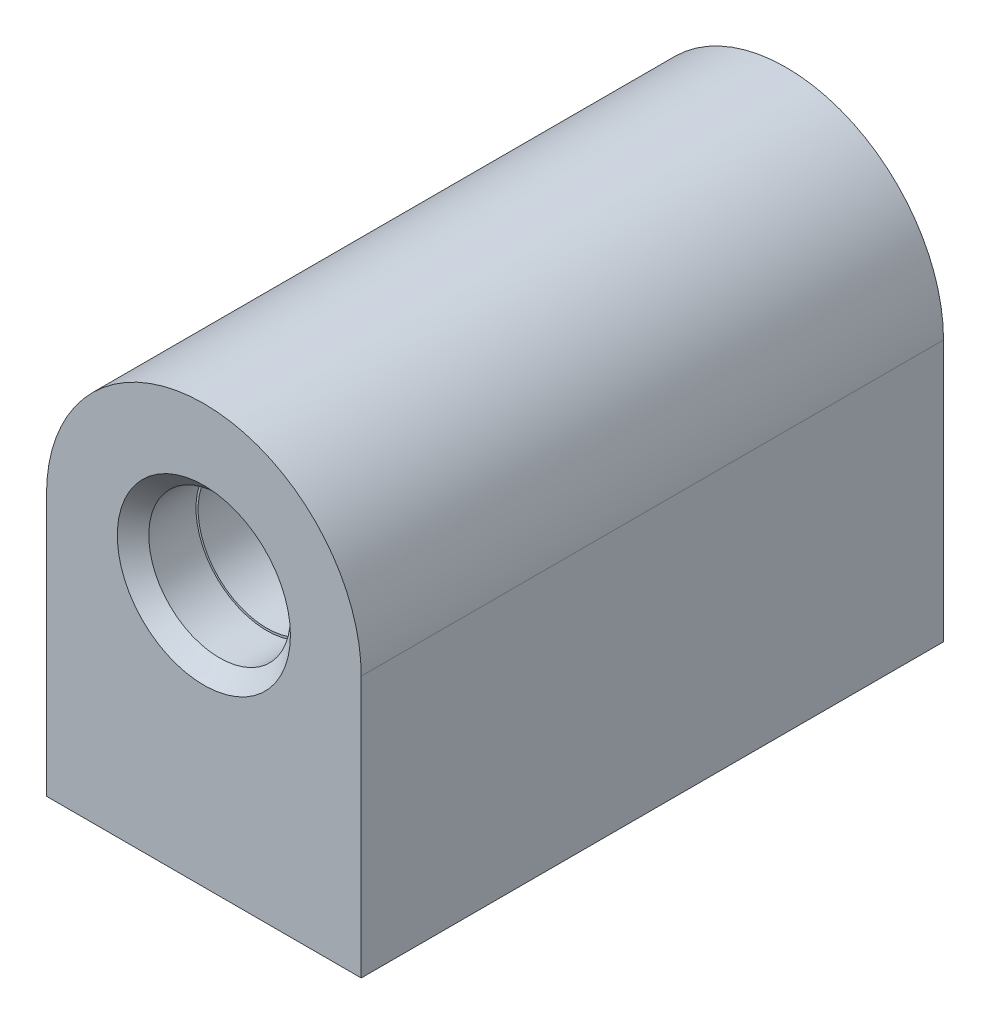
ISO-10303-21;
HEADER;
FILE_DESCRIPTION(('STEP AP214'),'2;1');
FILE_NAME('part.step','',(''),(''),'','','');
FILE_SCHEMA(('AUTOMOTIVE_DESIGN { 1 0 10303 214 1 1 1 1 }'));
ENDSEC;
DATA;
#1=APPLICATION_CONTEXT('core data for automotive mechanical design processes');
#2=APPLICATION_PROTOCOL_DEFINITION('international standard','automotive_design',2000,#1);
#3=PRODUCT_CONTEXT('',#1,'mechanical');
#4=PRODUCT('Part','Part','',(#3));
#5=PRODUCT_RELATED_PRODUCT_CATEGORY('part','',(#4));
#6=PRODUCT_DEFINITION_FORMATION('','',#4);
#7=PRODUCT_DEFINITION_CONTEXT('part definition',#1,'design');
#8=PRODUCT_DEFINITION('design','',#6,#7);
#9=PRODUCT_DEFINITION_SHAPE('','',#8);
#10=(LENGTH_UNIT() NAMED_UNIT(*) SI_UNIT(.MILLI.,.METRE.));
#11=(NAMED_UNIT(*) PLANE_ANGLE_UNIT() SI_UNIT($,.RADIAN.));
#12=(NAMED_UNIT(*) SI_UNIT($,.STERADIAN.) SOLID_ANGLE_UNIT());
#13=UNCERTAINTY_MEASURE_WITH_UNIT(LENGTH_MEASURE(1.E-05),#10,'distance_accuracy_value','');
#14=(GEOMETRIC_REPRESENTATION_CONTEXT(3) GLOBAL_UNCERTAINTY_ASSIGNED_CONTEXT((#13)) GLOBAL_UNIT_ASSIGNED_CONTEXT((#10,
#11,#12)) REPRESENTATION_CONTEXT('',''));
#15=CARTESIAN_POINT('',(0.,0.,0.));
#16=DIRECTION('',(0.,0.,1.));
#17=DIRECTION('',(1.,0.,0.));
#18=AXIS2_PLACEMENT_3D('',#15,#16,#17);
#19=CARTESIAN_POINT('',(0.,0.,37.));
#20=DIRECTION('',(0.,0.,-1.));
#21=DIRECTION('',(-1.,0.,0.));
#22=AXIS2_PLACEMENT_3D('',#19,#20,#21);
#23=CYLINDRICAL_SURFACE('',#22,10.);
#24=DIRECTION('',(0.,0.,-1.));
#25=VECTOR('',#24,1.);
#26=CARTESIAN_POINT('',(-10.,0.,37.));
#27=LINE('',#26,#25);
#28=CARTESIAN_POINT('',(-10.,0.,37.));
#29=VERTEX_POINT('',#28);
#30=CARTESIAN_POINT('',(-10.,0.,0.));
#31=VERTEX_POINT('',#30);
#32=EDGE_CURVE('E186',#29,#31,#27,.T.);
#33=ORIENTED_EDGE('',*,*,#32,.F.);
#34=CARTESIAN_POINT('',(0.,0.,37.));
#35=DIRECTION('',(0.,0.,1.));
#36=DIRECTION('',(1.,0.,0.));
#37=AXIS2_PLACEMENT_3D('',#34,#35,#36);
#38=CIRCLE('',#37,10.);
#39=CARTESIAN_POINT('',(10.,0.,37.));
#40=VERTEX_POINT('',#39);
#41=EDGE_CURVE('E215',#40,#29,#38,.T.);
#42=ORIENTED_EDGE('',*,*,#41,.F.);
#43=DIRECTION('',(0.,0.,-1.));
#44=VECTOR('',#43,1.);
#45=CARTESIAN_POINT('',(10.,0.,37.));
#46=LINE('',#45,#44);
#47=CARTESIAN_POINT('',(10.,0.,0.));
#48=VERTEX_POINT('',#47);
#49=EDGE_CURVE('E173',#40,#48,#46,.T.);
#50=ORIENTED_EDGE('',*,*,#49,.T.);
#51=CARTESIAN_POINT('',(0.,0.,0.));
#52=DIRECTION('',(0.,0.,1.));
#53=DIRECTION('',(1.,0.,0.));
#54=AXIS2_PLACEMENT_3D('',#51,#52,#53);
#55=CIRCLE('',#54,10.);
#56=EDGE_CURVE('E64',#48,#31,#55,.T.);
#57=ORIENTED_EDGE('',*,*,#56,.T.);
#58=EDGE_LOOP('',(#33,#42,#50,#57));
#59=FACE_BOUND('',#58,.T.);
#60=ADVANCED_FACE('F41',(#59),#23,.T.);
#61=CARTESIAN_POINT('',(0.,0.,37.));
#62=DIRECTION('',(0.,0.,-1.));
#63=DIRECTION('',(-1.,0.,0.));
#64=AXIS2_PLACEMENT_3D('',#61,#62,#63);
#65=CYLINDRICAL_SURFACE('',#64,4.365);
#66=CARTESIAN_POINT('',(0.,0.,30.));
#67=DIRECTION('',(0.,0.,1.));
#68=DIRECTION('',(1.,0.,0.));
#69=AXIS2_PLACEMENT_3D('',#66,#67,#68);
#70=CIRCLE('',#69,4.365);
#71=CARTESIAN_POINT('',(4.365,0.,30.));
#72=VERTEX_POINT('',#71);
#73=EDGE_CURVE('E195',#72,#72,#70,.T.);
#74=ORIENTED_EDGE('',*,*,#73,.F.);
#75=EDGE_LOOP('',(#74));
#76=FACE_BOUND('',#75,.T.);
#77=CARTESIAN_POINT('',(0.,0.,33.));
#78=DIRECTION('',(0.,0.,1.));
#79=DIRECTION('',(1.,0.,0.));
#80=AXIS2_PLACEMENT_3D('',#77,#78,#79);
#81=CIRCLE('',#80,4.365);
#82=CARTESIAN_POINT('',(4.365,0.,33.));
#83=VERTEX_POINT('',#82);
#84=EDGE_CURVE('E191',#83,#83,#81,.T.);
#85=ORIENTED_EDGE('',*,*,#84,.T.);
#86=EDGE_LOOP('',(#85));
#87=FACE_BOUND('',#86,.T.);
#88=ADVANCED_FACE('F286',(#76,#87),#65,.F.);
#89=CARTESIAN_POINT('',(0.,0.,25.8650000000001));
#90=DIRECTION('',(0.,0.,1.));
#91=DIRECTION('',(1.,0.,0.));
#92=AXIS2_PLACEMENT_3D('',#89,#90,#91);
#93=CIRCLE('',#92,4.365);
#94=CARTESIAN_POINT('',(4.365,0.,25.8650000000001));
#95=VERTEX_POINT('',#94);
#96=EDGE_CURVE('E218',#95,#95,#93,.T.);
#97=ORIENTED_EDGE('',*,*,#96,.T.);
#98=EDGE_LOOP('',(#97));
#99=FACE_BOUND('',#98,.T.);
#100=CARTESIAN_POINT('',(0.,0.,24.));
#101=DIRECTION('',(0.,0.,1.));
#102=DIRECTION('',(1.,0.,0.));
#103=AXIS2_PLACEMENT_3D('',#100,#101,#102);
#104=CIRCLE('',#103,4.365);
#105=CARTESIAN_POINT('',(4.365,0.,24.));
#106=VERTEX_POINT('',#105);
#107=EDGE_CURVE('E199',#106,#106,#104,.T.);
#108=ORIENTED_EDGE('',*,*,#107,.F.);
#109=EDGE_LOOP('',(#108));
#110=FACE_BOUND('',#109,.T.);
#111=ADVANCED_FACE('F291',(#99,#110),#65,.F.);
#112=CARTESIAN_POINT('',(0.,0.,19.8650000000001));
#113=DIRECTION('',(0.,0.,1.));
#114=DIRECTION('',(1.,0.,0.));
#115=AXIS2_PLACEMENT_3D('',#112,#113,#114);
#116=CIRCLE('',#115,4.365);
#117=CARTESIAN_POINT('',(4.365,0.,19.8650000000001));
#118=VERTEX_POINT('',#117);
#119=EDGE_CURVE('E232',#118,#118,#116,.T.);
#120=ORIENTED_EDGE('',*,*,#119,.T.);
#121=EDGE_LOOP('',(#120));
#122=FACE_BOUND('',#121,.T.);
#123=CARTESIAN_POINT('',(0.,0.,18.));
#124=DIRECTION('',(0.,0.,1.));
#125=DIRECTION('',(1.,0.,0.));
#126=AXIS2_PLACEMENT_3D('',#123,#124,#125);
#127=CIRCLE('',#126,4.365);
#128=CARTESIAN_POINT('',(4.365,0.,18.));
#129=VERTEX_POINT('',#128);
#130=EDGE_CURVE('E203',#129,#129,#127,.T.);
#131=ORIENTED_EDGE('',*,*,#130,.F.);
#132=EDGE_LOOP('',(#131));
#133=FACE_BOUND('',#132,.T.);
#134=ADVANCED_FACE('F402',(#122,#133),#65,.F.);
#135=CARTESIAN_POINT('',(0.,0.,13.8650000000001));
#136=DIRECTION('',(0.,0.,1.));
#137=DIRECTION('',(1.,0.,0.));
#138=AXIS2_PLACEMENT_3D('',#135,#136,#137);
#139=CIRCLE('',#138,4.365);
#140=CARTESIAN_POINT('',(4.365,0.,13.8650000000001));
#141=VERTEX_POINT('',#140);
#142=EDGE_CURVE('E235',#141,#141,#139,.T.);
#143=ORIENTED_EDGE('',*,*,#142,.T.);
#144=EDGE_LOOP('',(#143));
#145=FACE_BOUND('',#144,.T.);
#146=CARTESIAN_POINT('',(0.,0.,12.));
#147=DIRECTION('',(0.,0.,1.));
#148=DIRECTION('',(1.,0.,0.));
#149=AXIS2_PLACEMENT_3D('',#146,#147,#148);
#150=CIRCLE('',#149,4.365);
#151=CARTESIAN_POINT('',(4.365,0.,12.));
#152=VERTEX_POINT('',#151);
#153=EDGE_CURVE('E207',#152,#152,#150,.T.);
#154=ORIENTED_EDGE('',*,*,#153,.F.);
#155=EDGE_LOOP('',(#154));
#156=FACE_BOUND('',#155,.T.);
#157=ADVANCED_FACE('F396',(#145,#156),#65,.F.);
#158=CARTESIAN_POINT('',(0.,0.,7.86500000000008));
#159=DIRECTION('',(0.,0.,1.));
#160=DIRECTION('',(1.,0.,0.));
#161=AXIS2_PLACEMENT_3D('',#158,#159,#160);
#162=CIRCLE('',#161,4.365);
#163=CARTESIAN_POINT('',(4.365,0.,7.86500000000008));
#164=VERTEX_POINT('',#163);
#165=EDGE_CURVE('E238',#164,#164,#162,.T.);
#166=ORIENTED_EDGE('',*,*,#165,.T.);
#167=EDGE_LOOP('',(#166));
#168=FACE_BOUND('',#167,.T.);
#169=CARTESIAN_POINT('',(0.,0.,6.));
#170=DIRECTION('',(0.,0.,1.));
#171=DIRECTION('',(1.,0.,0.));
#172=AXIS2_PLACEMENT_3D('',#169,#170,#171);
#173=CIRCLE('',#172,4.365);
#174=CARTESIAN_POINT('',(4.365,0.,6.));
#175=VERTEX_POINT('',#174);
#176=EDGE_CURVE('E211',#175,#175,#173,.T.);
#177=ORIENTED_EDGE('',*,*,#176,.F.);
#178=EDGE_LOOP('',(#177));
#179=FACE_BOUND('',#178,.T.);
#180=ADVANCED_FACE('F332',(#168,#179),#65,.F.);
#181=CARTESIAN_POINT('',(0.,0.,1.86500000000008));
#182=DIRECTION('',(0.,0.,1.));
#183=DIRECTION('',(1.,0.,0.));
#184=AXIS2_PLACEMENT_3D('',#181,#182,#183);
#185=CIRCLE('',#184,4.365);
#186=CARTESIAN_POINT('',(4.365,0.,1.86500000000008));
#187=VERTEX_POINT('',#186);
#188=EDGE_CURVE('E241',#187,#187,#185,.T.);
#189=ORIENTED_EDGE('',*,*,#188,.T.);
#190=EDGE_LOOP('',(#189));
#191=FACE_BOUND('',#190,.T.);
#192=CARTESIAN_POINT('',(0.,0.,0.));
#193=DIRECTION('',(0.,0.,1.));
#194=DIRECTION('',(1.,0.,0.));
#195=AXIS2_PLACEMENT_3D('',#192,#193,#194);
#196=CIRCLE('',#195,4.365);
#197=CARTESIAN_POINT('',(4.365,0.,0.));
#198=VERTEX_POINT('',#197);
#199=EDGE_CURVE('E212',#198,#198,#196,.T.);
#200=ORIENTED_EDGE('',*,*,#199,.F.);
#201=EDGE_LOOP('',(#200));
#202=FACE_BOUND('',#201,.T.);
#203=ADVANCED_FACE('F294',(#191,#202),#65,.F.);
#204=CARTESIAN_POINT('',(0.,0.,37.));
#205=DIRECTION('',(0.,0.,1.));
#206=DIRECTION('',(1.,0.,0.));
#207=AXIS2_PLACEMENT_3D('',#204,#205,#206);
#208=PLANE('',#207);
#209=CARTESIAN_POINT('',(0.,0.,37.));
#210=DIRECTION('',(0.,0.,1.));
#211=DIRECTION('',(1.,0.,0.));
#212=AXIS2_PLACEMENT_3D('',#209,#210,#211);
#213=CIRCLE('',#212,5.50000000000002);
#214=CARTESIAN_POINT('',(5.50000000000002,0.,37.));
#215=VERTEX_POINT('',#214);
#216=EDGE_CURVE('E249',#215,#215,#213,.F.);
#217=ORIENTED_EDGE('',*,*,#216,.T.);
#218=EDGE_LOOP('',(#217));
#219=FACE_BOUND('',#218,.T.);
#220=ORIENTED_EDGE('',*,*,#41,.T.);
#221=DIRECTION('',(0.,-1.,0.));
#222=VECTOR('',#221,1.);
#223=CARTESIAN_POINT('',(-10.,0.,37.));
#224=LINE('',#223,#222);
#225=CARTESIAN_POINT('',(-10.,-16.611303618549,37.));
#226=VERTEX_POINT('',#225);
#227=EDGE_CURVE('E165',#29,#226,#224,.T.);
#228=ORIENTED_EDGE('',*,*,#227,.T.);
#229=DIRECTION('',(1.,0.,0.));
#230=VECTOR('',#229,1.);
#231=CARTESIAN_POINT('',(0.,-16.611303618549,37.));
#232=LINE('',#231,#230);
#233=CARTESIAN_POINT('',(10.,-16.611303618549,37.));
#234=VERTEX_POINT('',#233);
#235=EDGE_CURVE('E167',#226,#234,#232,.T.);
#236=ORIENTED_EDGE('',*,*,#235,.T.);
#237=DIRECTION('',(0.,-1.,0.));
#238=VECTOR('',#237,1.);
#239=CARTESIAN_POINT('',(10.,0.,37.));
#240=LINE('',#239,#238);
#241=EDGE_CURVE('E170',#40,#234,#240,.T.);
#242=ORIENTED_EDGE('',*,*,#241,.F.);
#243=EDGE_LOOP('',(#220,#228,#236,#242));
#244=FACE_BOUND('',#243,.T.);
#245=ADVANCED_FACE('F331',(#219,#244),#208,.T.);
#246=CARTESIAN_POINT('',(0.,0.,0.));
#247=DIRECTION('',(0.,0.,1.));
#248=DIRECTION('',(1.,0.,0.));
#249=AXIS2_PLACEMENT_3D('',#246,#247,#248);
#250=PLANE('',#249);
#251=ORIENTED_EDGE('',*,*,#56,.F.);
#252=DIRECTION('',(0.,-1.,0.));
#253=VECTOR('',#252,1.);
#254=CARTESIAN_POINT('',(10.,0.,0.));
#255=LINE('',#254,#253);
#256=CARTESIAN_POINT('',(10.,-16.611303618549,0.));
#257=VERTEX_POINT('',#256);
#258=EDGE_CURVE('E168',#48,#257,#255,.T.);
#259=ORIENTED_EDGE('',*,*,#258,.T.);
#260=DIRECTION('',(1.,0.,0.));
#261=VECTOR('',#260,1.);
#262=CARTESIAN_POINT('',(0.,-16.611303618549,0.));
#263=LINE('',#262,#261);
#264=CARTESIAN_POINT('',(-10.,-16.611303618549,0.));
#265=VERTEX_POINT('',#264);
#266=EDGE_CURVE('E175',#265,#257,#263,.T.);
#267=ORIENTED_EDGE('',*,*,#266,.F.);
#268=DIRECTION('',(0.,-1.,0.));
#269=VECTOR('',#268,1.);
#270=CARTESIAN_POINT('',(-10.,0.,0.));
#271=LINE('',#270,#269);
#272=EDGE_CURVE('E164',#31,#265,#271,.T.);
#273=ORIENTED_EDGE('',*,*,#272,.F.);
#274=EDGE_LOOP('',(#251,#259,#267,#273));
#275=FACE_BOUND('',#274,.T.);
#276=ORIENTED_EDGE('',*,*,#199,.T.);
#277=EDGE_LOOP('',(#276));
#278=FACE_BOUND('',#277,.T.);
#279=ADVANCED_FACE('F297',(#275,#278),#250,.F.);
#280=CARTESIAN_POINT('',(0.,0.,6.));
#281=DIRECTION('',(0.,0.,1.));
#282=DIRECTION('',(1.,0.,0.));
#283=AXIS2_PLACEMENT_3D('',#280,#281,#282);
#284=PLANE('',#283);
#285=ORIENTED_EDGE('',*,*,#176,.T.);
#286=EDGE_LOOP('',(#285));
#287=FACE_BOUND('',#286,.T.);
#288=CARTESIAN_POINT('',(0.,0.,6.));
#289=DIRECTION('',(0.,0.,1.));
#290=DIRECTION('',(1.,0.,0.));
#291=AXIS2_PLACEMENT_3D('',#288,#289,#290);
#292=CIRCLE('',#291,8.5);
#293=CARTESIAN_POINT('',(8.5,0.,6.));
#294=VERTEX_POINT('',#293);
#295=EDGE_CURVE('E208',#294,#294,#292,.T.);
#296=ORIENTED_EDGE('',*,*,#295,.F.);
#297=EDGE_LOOP('',(#296));
#298=FACE_BOUND('',#297,.T.);
#299=ADVANCED_FACE('F336',(#287,#298),#284,.F.);
#300=CARTESIAN_POINT('',(0.,0.,12.));
#301=DIRECTION('',(0.,0.,1.));
#302=DIRECTION('',(1.,0.,0.));
#303=AXIS2_PLACEMENT_3D('',#300,#301,#302);
#304=PLANE('',#303);
#305=ORIENTED_EDGE('',*,*,#153,.T.);
#306=EDGE_LOOP('',(#305));
#307=FACE_BOUND('',#306,.T.);
#308=CARTESIAN_POINT('',(0.,0.,12.));
#309=DIRECTION('',(0.,0.,1.));
#310=DIRECTION('',(1.,0.,0.));
#311=AXIS2_PLACEMENT_3D('',#308,#309,#310);
#312=CIRCLE('',#311,8.5);
#313=CARTESIAN_POINT('',(8.5,0.,12.));
#314=VERTEX_POINT('',#313);
#315=EDGE_CURVE('E204',#314,#314,#312,.T.);
#316=ORIENTED_EDGE('',*,*,#315,.F.);
#317=EDGE_LOOP('',(#316));
#318=FACE_BOUND('',#317,.T.);
#319=ADVANCED_FACE('F342',(#307,#318),#304,.F.);
#320=CARTESIAN_POINT('',(0.,0.,18.));
#321=DIRECTION('',(0.,0.,1.));
#322=DIRECTION('',(1.,0.,0.));
#323=AXIS2_PLACEMENT_3D('',#320,#321,#322);
#324=PLANE('',#323);
#325=ORIENTED_EDGE('',*,*,#130,.T.);
#326=EDGE_LOOP('',(#325));
#327=FACE_BOUND('',#326,.T.);
#328=CARTESIAN_POINT('',(0.,0.,18.));
#329=DIRECTION('',(0.,0.,1.));
#330=DIRECTION('',(1.,0.,0.));
#331=AXIS2_PLACEMENT_3D('',#328,#329,#330);
#332=CIRCLE('',#331,8.5);
#333=CARTESIAN_POINT('',(8.5,0.,18.));
#334=VERTEX_POINT('',#333);
#335=EDGE_CURVE('E200',#334,#334,#332,.T.);
#336=ORIENTED_EDGE('',*,*,#335,.F.);
#337=EDGE_LOOP('',(#336));
#338=FACE_BOUND('',#337,.T.);
#339=ADVANCED_FACE('F379',(#327,#338),#324,.F.);
#340=CARTESIAN_POINT('',(0.,0.,24.));
#341=DIRECTION('',(0.,0.,1.));
#342=DIRECTION('',(1.,0.,0.));
#343=AXIS2_PLACEMENT_3D('',#340,#341,#342);
#344=PLANE('',#343);
#345=ORIENTED_EDGE('',*,*,#107,.T.);
#346=EDGE_LOOP('',(#345));
#347=FACE_BOUND('',#346,.T.);
#348=CARTESIAN_POINT('',(0.,0.,24.));
#349=DIRECTION('',(0.,0.,1.));
#350=DIRECTION('',(1.,0.,0.));
#351=AXIS2_PLACEMENT_3D('',#348,#349,#350);
#352=CIRCLE('',#351,8.5);
#353=CARTESIAN_POINT('',(8.5,0.,24.));
#354=VERTEX_POINT('',#353);
#355=EDGE_CURVE('E196',#354,#354,#352,.T.);
#356=ORIENTED_EDGE('',*,*,#355,.F.);
#357=EDGE_LOOP('',(#356));
#358=FACE_BOUND('',#357,.T.);
#359=ADVANCED_FACE('F375',(#347,#358),#344,.F.);
#360=CARTESIAN_POINT('',(0.,0.,30.));
#361=DIRECTION('',(0.,0.,1.));
#362=DIRECTION('',(1.,0.,0.));
#363=AXIS2_PLACEMENT_3D('',#360,#361,#362);
#364=PLANE('',#363);
#365=ORIENTED_EDGE('',*,*,#73,.T.);
#366=EDGE_LOOP('',(#365));
#367=FACE_BOUND('',#366,.T.);
#368=CARTESIAN_POINT('',(0.,0.,30.));
#369=DIRECTION('',(0.,0.,1.));
#370=DIRECTION('',(1.,0.,0.));
#371=AXIS2_PLACEMENT_3D('',#368,#369,#370);
#372=CIRCLE('',#371,8.5);
#373=CARTESIAN_POINT('',(8.5,0.,30.));
#374=VERTEX_POINT('',#373);
#375=EDGE_CURVE('E192',#374,#374,#372,.T.);
#376=ORIENTED_EDGE('',*,*,#375,.F.);
#377=EDGE_LOOP('',(#376));
#378=FACE_BOUND('',#377,.T.);
#379=ADVANCED_FACE('F303',(#367,#378),#364,.F.);
#380=CARTESIAN_POINT('',(0.,0.,25.));
#381=DIRECTION('',(0.,0.,1.));
#382=DIRECTION('',(1.,0.,0.));
#383=AXIS2_PLACEMENT_3D('',#380,#381,#382);
#384=CONICAL_SURFACE('',#383,3.49999999999991,0.785398163397453);
#385=ORIENTED_EDGE('',*,*,#375,.T.);
#386=EDGE_LOOP('',(#385));
#387=FACE_BOUND('',#386,.T.);
#388=ORIENTED_EDGE('',*,*,#96,.F.);
#389=EDGE_LOOP('',(#388));
#390=FACE_BOUND('',#389,.T.);
#391=ADVANCED_FACE('F299',(#387,#390),#384,.F.);
#392=CARTESIAN_POINT('',(0.,0.,19.));
#393=DIRECTION('',(0.,0.,1.));
#394=DIRECTION('',(1.,0.,0.));
#395=AXIS2_PLACEMENT_3D('',#392,#393,#394);
#396=CONICAL_SURFACE('',#395,3.49999999999991,0.785398163397453);
#397=ORIENTED_EDGE('',*,*,#355,.T.);
#398=EDGE_LOOP('',(#397));
#399=FACE_BOUND('',#398,.T.);
#400=ORIENTED_EDGE('',*,*,#119,.F.);
#401=EDGE_LOOP('',(#400));
#402=FACE_BOUND('',#401,.T.);
#403=ADVANCED_FACE('F302',(#399,#402),#396,.F.);
#404=CARTESIAN_POINT('',(0.,0.,13.));
#405=DIRECTION('',(0.,0.,1.));
#406=DIRECTION('',(1.,0.,0.));
#407=AXIS2_PLACEMENT_3D('',#404,#405,#406);
#408=CONICAL_SURFACE('',#407,3.49999999999991,0.785398163397453);
#409=ORIENTED_EDGE('',*,*,#335,.T.);
#410=EDGE_LOOP('',(#409));
#411=FACE_BOUND('',#410,.T.);
#412=ORIENTED_EDGE('',*,*,#142,.F.);
#413=EDGE_LOOP('',(#412));
#414=FACE_BOUND('',#413,.T.);
#415=ADVANCED_FACE('F307',(#411,#414),#408,.F.);
#416=CARTESIAN_POINT('',(0.,0.,7.));
#417=DIRECTION('',(0.,0.,1.));
#418=DIRECTION('',(1.,0.,0.));
#419=AXIS2_PLACEMENT_3D('',#416,#417,#418);
#420=CONICAL_SURFACE('',#419,3.49999999999991,0.785398163397454);
#421=ORIENTED_EDGE('',*,*,#315,.T.);
#422=EDGE_LOOP('',(#421));
#423=FACE_BOUND('',#422,.T.);
#424=ORIENTED_EDGE('',*,*,#165,.F.);
#425=EDGE_LOOP('',(#424));
#426=FACE_BOUND('',#425,.T.);
#427=ADVANCED_FACE('F311',(#423,#426),#420,.F.);
#428=CARTESIAN_POINT('',(0.,0.,1.));
#429=DIRECTION('',(0.,0.,1.));
#430=DIRECTION('',(1.,0.,0.));
#431=AXIS2_PLACEMENT_3D('',#428,#429,#430);
#432=CONICAL_SURFACE('',#431,3.49999999999991,0.785398163397453);
#433=ORIENTED_EDGE('',*,*,#295,.T.);
#434=EDGE_LOOP('',(#433));
#435=FACE_BOUND('',#434,.T.);
#436=ORIENTED_EDGE('',*,*,#188,.F.);
#437=EDGE_LOOP('',(#436));
#438=FACE_BOUND('',#437,.T.);
#439=ADVANCED_FACE('F314',(#435,#438),#432,.F.);
#440=CARTESIAN_POINT('',(0.,0.,33.));
#441=DIRECTION('',(0.,0.,1.));
#442=DIRECTION('',(1.,0.,0.));
#443=AXIS2_PLACEMENT_3D('',#440,#441,#442);
#444=CYLINDRICAL_SURFACE('',#443,4.5);
#445=CARTESIAN_POINT('',(0.,0.,36.));
#446=DIRECTION('',(0.,0.,1.));
#447=DIRECTION('',(1.,0.,0.));
#448=AXIS2_PLACEMENT_3D('',#445,#446,#447);
#449=CIRCLE('',#448,4.5);
#450=CARTESIAN_POINT('',(4.5,0.,36.));
#451=VERTEX_POINT('',#450);
#452=EDGE_CURVE('E244',#451,#451,#449,.T.);
#453=ORIENTED_EDGE('',*,*,#452,.T.);
#454=EDGE_LOOP('',(#453));
#455=FACE_BOUND('',#454,.T.);
#456=CARTESIAN_POINT('',(0.,0.,33.));
#457=DIRECTION('',(0.,0.,1.));
#458=DIRECTION('',(1.,0.,0.));
#459=AXIS2_PLACEMENT_3D('',#456,#457,#458);
#460=CIRCLE('',#459,4.5);
#461=CARTESIAN_POINT('',(4.5,0.,33.));
#462=VERTEX_POINT('',#461);
#463=EDGE_CURVE('E188',#462,#462,#460,.T.);
#464=ORIENTED_EDGE('',*,*,#463,.F.);
#465=EDGE_LOOP('',(#464));
#466=FACE_BOUND('',#465,.T.);
#467=ADVANCED_FACE('F317',(#455,#466),#444,.F.);
#468=CARTESIAN_POINT('',(0.,0.,33.));
#469=DIRECTION('',(0.,0.,1.));
#470=DIRECTION('',(1.,0.,0.));
#471=AXIS2_PLACEMENT_3D('',#468,#469,#470);
#472=PLANE('',#471);
#473=ORIENTED_EDGE('',*,*,#84,.F.);
#474=EDGE_LOOP('',(#473));
#475=FACE_BOUND('',#474,.T.);
#476=ORIENTED_EDGE('',*,*,#463,.T.);
#477=EDGE_LOOP('',(#476));
#478=FACE_BOUND('',#477,.T.);
#479=ADVANCED_FACE('F322',(#475,#478),#472,.T.);
#480=CARTESIAN_POINT('',(0.,0.,36.));
#481=DIRECTION('',(0.,0.,1.));
#482=DIRECTION('',(1.,0.,0.));
#483=AXIS2_PLACEMENT_3D('',#480,#481,#482);
#484=CONICAL_SURFACE('',#483,4.5,0.785398163397457);
#485=ORIENTED_EDGE('',*,*,#216,.F.);
#486=EDGE_LOOP('',(#485));
#487=FACE_BOUND('',#486,.T.);
#488=ORIENTED_EDGE('',*,*,#452,.F.);
#489=EDGE_LOOP('',(#488));
#490=FACE_BOUND('',#489,.T.);
#491=ADVANCED_FACE('F43',(#487,#490),#484,.F.);
#492=CARTESIAN_POINT('',(-10.,0.,37.));
#493=DIRECTION('',(1.,0.,0.));
#494=DIRECTION('',(0.,0.,-1.));
#495=AXIS2_PLACEMENT_3D('',#492,#493,#494);
#496=PLANE('',#495);
#497=ORIENTED_EDGE('',*,*,#272,.T.);
#498=DIRECTION('',(0.,0.,-1.));
#499=VECTOR('',#498,1.);
#500=CARTESIAN_POINT('',(-10.,-16.611303618549,37.));
#501=LINE('',#500,#499);
#502=EDGE_CURVE('E183',#226,#265,#501,.T.);
#503=ORIENTED_EDGE('',*,*,#502,.F.);
#504=ORIENTED_EDGE('',*,*,#227,.F.);
#505=ORIENTED_EDGE('',*,*,#32,.T.);
#506=EDGE_LOOP('',(#497,#503,#504,#505));
#507=FACE_BOUND('',#506,.T.);
#508=ADVANCED_FACE('F358',(#507),#496,.F.);
#509=CARTESIAN_POINT('',(0.,-16.611303618549,37.));
#510=DIRECTION('',(0.,1.,0.));
#511=DIRECTION('',(0.,0.,1.));
#512=AXIS2_PLACEMENT_3D('',#509,#510,#511);
#513=PLANE('',#512);
#514=DIRECTION('',(0.,0.,1.));
#515=VECTOR('',#514,1.);
#516=CARTESIAN_POINT('',(-5.8,-16.611303618549,37.));
#517=LINE('',#516,#515);
#518=CARTESIAN_POINT('',(-5.8,-16.611303618549,15.1513684387002));
#519=VERTEX_POINT('',#518);
#520=CARTESIAN_POINT('',(-5.8,-16.611303618549,21.8486315612998));
#521=VERTEX_POINT('',#520);
#522=EDGE_CURVE('E49',#519,#521,#517,.T.);
#523=ORIENTED_EDGE('',*,*,#522,.T.);
#524=DIRECTION('',(0.866025403784439,0.,0.5));
#525=VECTOR('',#524,1.);
#526=CARTESIAN_POINT('',(5.11073498500606,-16.611303618549,28.1479473419497));
#527=LINE('',#526,#525);
#528=CARTESIAN_POINT('',(0.,-16.611303618549,25.1972631225997));
#529=VERTEX_POINT('',#528);
#530=EDGE_CURVE('E12',#521,#529,#527,.T.);
#531=ORIENTED_EDGE('',*,*,#530,.T.);
#532=DIRECTION('',(0.866025403784438,0.,-0.5));
#533=VECTOR('',#532,1.);
#534=CARTESIAN_POINT('',(-5.11073498500606,-16.611303618549,28.1479473419497));
#535=LINE('',#534,#533);
#536=CARTESIAN_POINT('',(5.8,-16.611303618549,21.8486315612998));
#537=VERTEX_POINT('',#536);
#538=EDGE_CURVE('E121',#529,#537,#535,.T.);
#539=ORIENTED_EDGE('',*,*,#538,.T.);
#540=DIRECTION('',(0.,0.,-1.));
#541=VECTOR('',#540,1.);
#542=CARTESIAN_POINT('',(5.80000000000001,-16.611303618549,37.));
#543=LINE('',#542,#541);
#544=CARTESIAN_POINT('',(5.8,-16.611303618549,15.1513684387002));
#545=VERTEX_POINT('',#544);
#546=EDGE_CURVE('E253',#537,#545,#543,.T.);
#547=ORIENTED_EDGE('',*,*,#546,.T.);
#548=DIRECTION('',(-0.866025403784439,0.,-0.5));
#549=VECTOR('',#548,1.);
#550=CARTESIAN_POINT('',(10.9107349850061,-16.611303618549,18.1020526580503));
#551=LINE('',#550,#549);
#552=CARTESIAN_POINT('',(0.,-16.611303618549,11.8027368774003));
#553=VERTEX_POINT('',#552);
#554=EDGE_CURVE('E256',#545,#553,#551,.T.);
#555=ORIENTED_EDGE('',*,*,#554,.T.);
#556=DIRECTION('',(-0.866025403784439,0.,0.5));
#557=VECTOR('',#556,1.);
#558=CARTESIAN_POINT('',(-10.9107349850061,-16.611303618549,18.1020526580503));
#559=LINE('',#558,#557);
#560=EDGE_CURVE('E259',#553,#519,#559,.T.);
#561=ORIENTED_EDGE('',*,*,#560,.T.);
#562=EDGE_LOOP('',(#523,#531,#539,#547,#555,#561));
#563=FACE_BOUND('',#562,.T.);
#564=ORIENTED_EDGE('',*,*,#266,.T.);
#565=DIRECTION('',(0.,0.,-1.));
#566=VECTOR('',#565,1.);
#567=CARTESIAN_POINT('',(10.,-16.611303618549,37.));
#568=LINE('',#567,#566);
#569=EDGE_CURVE('E181',#234,#257,#568,.T.);
#570=ORIENTED_EDGE('',*,*,#569,.F.);
#571=ORIENTED_EDGE('',*,*,#235,.F.);
#572=ORIENTED_EDGE('',*,*,#502,.T.);
#573=EDGE_LOOP('',(#564,#570,#571,#572));
#574=FACE_BOUND('',#573,.T.);
#575=ADVANCED_FACE('F263',(#563,#574),#513,.F.);
#576=CARTESIAN_POINT('',(10.,0.,37.));
#577=DIRECTION('',(1.,0.,0.));
#578=DIRECTION('',(0.,0.,-1.));
#579=AXIS2_PLACEMENT_3D('',#576,#577,#578);
#580=PLANE('',#579);
#581=ORIENTED_EDGE('',*,*,#258,.F.);
#582=ORIENTED_EDGE('',*,*,#49,.F.);
#583=ORIENTED_EDGE('',*,*,#241,.T.);
#584=ORIENTED_EDGE('',*,*,#569,.T.);
#585=EDGE_LOOP('',(#581,#582,#583,#584));
#586=FACE_BOUND('',#585,.T.);
#587=ADVANCED_FACE('F352',(#586),#580,.T.);
#588=CARTESIAN_POINT('',(-5.8,-17.,21.8486315612998));
#589=DIRECTION('',(-0.5,0.,0.866025403784439));
#590=DIRECTION('',(0.866025403784439,0.,0.5));
#591=AXIS2_PLACEMENT_3D('',#588,#589,#590);
#592=PLANE('',#591);
#593=DIRECTION('',(0.,1.,0.));
#594=VECTOR('',#593,1.);
#595=CARTESIAN_POINT('',(-5.8,-17.,21.8486315612998));
#596=LINE('',#595,#594);
#597=CARTESIAN_POINT('',(-5.8,-12.,21.8486315612998));
#598=VERTEX_POINT('',#597);
#599=EDGE_CURVE('E139',#521,#598,#596,.T.);
#600=ORIENTED_EDGE('',*,*,#599,.T.);
#601=DIRECTION('',(0.866025403784439,0.,0.5));
#602=VECTOR('',#601,1.);
#603=CARTESIAN_POINT('',(-5.8,-12.,21.8486315612998));
#604=LINE('',#603,#602);
#605=CARTESIAN_POINT('',(0.,-12.,25.1972631225997));
#606=VERTEX_POINT('',#605);
#607=EDGE_CURVE('E131',#598,#606,#604,.T.);
#608=ORIENTED_EDGE('',*,*,#607,.T.);
#609=DIRECTION('',(0.,1.,0.));
#610=VECTOR('',#609,1.);
#611=CARTESIAN_POINT('',(0.,-17.,25.1972631225997));
#612=LINE('',#611,#610);
#613=EDGE_CURVE('E116',#529,#606,#612,.T.);
#614=ORIENTED_EDGE('',*,*,#613,.F.);
#615=ORIENTED_EDGE('',*,*,#530,.F.);
#616=EDGE_LOOP('',(#600,#608,#614,#615));
#617=FACE_BOUND('',#616,.T.);
#618=ADVANCED_FACE('F137',(#617),#592,.F.);
#619=CARTESIAN_POINT('',(-5.8,-17.,15.1513684387002));
#620=DIRECTION('',(-1.,0.,0.));
#621=DIRECTION('',(0.,0.,1.));
#622=AXIS2_PLACEMENT_3D('',#619,#620,#621);
#623=PLANE('',#622);
#624=DIRECTION('',(0.,1.,0.));
#625=VECTOR('',#624,1.);
#626=CARTESIAN_POINT('',(-5.8,-17.,15.1513684387002));
#627=LINE('',#626,#625);
#628=CARTESIAN_POINT('',(-5.8,-12.,15.1513684387002));
#629=VERTEX_POINT('',#628);
#630=EDGE_CURVE('E155',#519,#629,#627,.T.);
#631=ORIENTED_EDGE('',*,*,#630,.T.);
#632=DIRECTION('',(0.,0.,1.));
#633=VECTOR('',#632,1.);
#634=CARTESIAN_POINT('',(-5.8,-12.,15.1513684387002));
#635=LINE('',#634,#633);
#636=EDGE_CURVE('E124',#629,#598,#635,.T.);
#637=ORIENTED_EDGE('',*,*,#636,.T.);
#638=ORIENTED_EDGE('',*,*,#599,.F.);
#639=ORIENTED_EDGE('',*,*,#522,.F.);
#640=EDGE_LOOP('',(#631,#637,#638,#639));
#641=FACE_BOUND('',#640,.T.);
#642=ADVANCED_FACE('F267',(#641),#623,.F.);
#643=CARTESIAN_POINT('',(0.,-17.,11.8027368774003));
#644=DIRECTION('',(-0.5,0.,-0.866025403784438));
#645=DIRECTION('',(-0.866025403784439,0.,0.5));
#646=AXIS2_PLACEMENT_3D('',#643,#644,#645);
#647=PLANE('',#646);
#648=DIRECTION('',(0.,1.,0.));
#649=VECTOR('',#648,1.);
#650=CARTESIAN_POINT('',(0.,-17.,11.8027368774003));
#651=LINE('',#650,#649);
#652=CARTESIAN_POINT('',(0.,-12.,11.8027368774003));
#653=VERTEX_POINT('',#652);
#654=EDGE_CURVE('E157',#553,#653,#651,.T.);
#655=ORIENTED_EDGE('',*,*,#654,.T.);
#656=DIRECTION('',(-0.866025403784438,0.,0.5));
#657=VECTOR('',#656,1.);
#658=CARTESIAN_POINT('',(0.,-12.,11.8027368774003));
#659=LINE('',#658,#657);
#660=EDGE_CURVE('E149',#653,#629,#659,.T.);
#661=ORIENTED_EDGE('',*,*,#660,.T.);
#662=ORIENTED_EDGE('',*,*,#630,.F.);
#663=ORIENTED_EDGE('',*,*,#560,.F.);
#664=EDGE_LOOP('',(#655,#661,#662,#663));
#665=FACE_BOUND('',#664,.T.);
#666=ADVANCED_FACE('F269',(#665),#647,.F.);
#667=CARTESIAN_POINT('',(5.8,-17.,15.1513684387002));
#668=DIRECTION('',(0.5,0.,-0.866025403784439));
#669=DIRECTION('',(-0.866025403784439,0.,-0.5));
#670=AXIS2_PLACEMENT_3D('',#667,#668,#669);
#671=PLANE('',#670);
#672=DIRECTION('',(0.,1.,0.));
#673=VECTOR('',#672,1.);
#674=CARTESIAN_POINT('',(5.8,-17.,15.1513684387002));
#675=LINE('',#674,#673);
#676=CARTESIAN_POINT('',(5.8,-12.,15.1513684387002));
#677=VERTEX_POINT('',#676);
#678=EDGE_CURVE('E159',#545,#677,#675,.T.);
#679=ORIENTED_EDGE('',*,*,#678,.T.);
#680=DIRECTION('',(-0.866025403784439,0.,-0.5));
#681=VECTOR('',#680,1.);
#682=CARTESIAN_POINT('',(5.8,-12.,15.1513684387002));
#683=LINE('',#682,#681);
#684=EDGE_CURVE('E146',#677,#653,#683,.T.);
#685=ORIENTED_EDGE('',*,*,#684,.T.);
#686=ORIENTED_EDGE('',*,*,#654,.F.);
#687=ORIENTED_EDGE('',*,*,#554,.F.);
#688=EDGE_LOOP('',(#679,#685,#686,#687));
#689=FACE_BOUND('',#688,.T.);
#690=ADVANCED_FACE('F273',(#689),#671,.F.);
#691=CARTESIAN_POINT('',(5.8,-17.,21.8486315612998));
#692=DIRECTION('',(1.,0.,0.));
#693=DIRECTION('',(0.,0.,-1.));
#694=AXIS2_PLACEMENT_3D('',#691,#692,#693);
#695=PLANE('',#694);
#696=DIRECTION('',(0.,1.,0.));
#697=VECTOR('',#696,1.);
#698=CARTESIAN_POINT('',(5.8,-17.,21.8486315612998));
#699=LINE('',#698,#697);
#700=CARTESIAN_POINT('',(5.8,-12.,21.8486315612998));
#701=VERTEX_POINT('',#700);
#702=EDGE_CURVE('E56',#537,#701,#699,.T.);
#703=ORIENTED_EDGE('',*,*,#702,.T.);
#704=DIRECTION('',(0.,0.,-1.));
#705=VECTOR('',#704,1.);
#706=CARTESIAN_POINT('',(5.8,-12.,21.8486315612998));
#707=LINE('',#706,#705);
#708=EDGE_CURVE('E135',#701,#677,#707,.T.);
#709=ORIENTED_EDGE('',*,*,#708,.T.);
#710=ORIENTED_EDGE('',*,*,#678,.F.);
#711=ORIENTED_EDGE('',*,*,#546,.F.);
#712=EDGE_LOOP('',(#703,#709,#710,#711));
#713=FACE_BOUND('',#712,.T.);
#714=ADVANCED_FACE('F276',(#713),#695,.F.);
#715=CARTESIAN_POINT('',(0.,-17.,25.1972631225997));
#716=DIRECTION('',(0.5,0.,0.866025403784438));
#717=DIRECTION('',(0.866025403784438,0.,-0.5));
#718=AXIS2_PLACEMENT_3D('',#715,#716,#717);
#719=PLANE('',#718);
#720=ORIENTED_EDGE('',*,*,#613,.T.);
#721=DIRECTION('',(0.866025403784439,0.,-0.5));
#722=VECTOR('',#721,1.);
#723=CARTESIAN_POINT('',(0.,-12.,25.1972631225997));
#724=LINE('',#723,#722);
#725=EDGE_CURVE('E119',#606,#701,#724,.T.);
#726=ORIENTED_EDGE('',*,*,#725,.T.);
#727=ORIENTED_EDGE('',*,*,#702,.F.);
#728=ORIENTED_EDGE('',*,*,#538,.F.);
#729=EDGE_LOOP('',(#720,#726,#727,#728));
#730=FACE_BOUND('',#729,.T.);
#731=ADVANCED_FACE('F118',(#730),#719,.F.);
#732=CARTESIAN_POINT('',(0.,-12.,0.));
#733=DIRECTION('',(0.,1.,0.));
#734=DIRECTION('',(0.,0.,1.));
#735=AXIS2_PLACEMENT_3D('',#732,#733,#734);
#736=PLANE('',#735);
#737=CARTESIAN_POINT('',(0.,-12.,18.5));
#738=DIRECTION('',(0.,1.,0.));
#739=DIRECTION('',(0.,0.,1.));
#740=AXIS2_PLACEMENT_3D('',#737,#738,#739);
#741=CIRCLE('',#740,3.3);
#742=CARTESIAN_POINT('',(0.,-12.,21.8));
#743=VERTEX_POINT('',#742);
#744=EDGE_CURVE('E140',#743,#743,#741,.T.);
#745=ORIENTED_EDGE('',*,*,#744,.T.);
#746=EDGE_LOOP('',(#745));
#747=FACE_BOUND('',#746,.T.);
#748=ORIENTED_EDGE('',*,*,#607,.F.);
#749=ORIENTED_EDGE('',*,*,#636,.F.);
#750=ORIENTED_EDGE('',*,*,#660,.F.);
#751=ORIENTED_EDGE('',*,*,#684,.F.);
#752=ORIENTED_EDGE('',*,*,#708,.F.);
#753=ORIENTED_EDGE('',*,*,#725,.F.);
#754=EDGE_LOOP('',(#748,#749,#750,#751,#752,#753));
#755=FACE_BOUND('',#754,.T.);
#756=ADVANCED_FACE('F129',(#747,#755),#736,.F.);
#757=CARTESIAN_POINT('',(0.,-10.,18.5));
#758=DIRECTION('',(0.,1.,0.));
#759=DIRECTION('',(0.,0.,1.));
#760=AXIS2_PLACEMENT_3D('',#757,#758,#759);
#761=PLANE('',#760);
#762=CARTESIAN_POINT('',(0.,-10.,18.5));
#763=DIRECTION('',(0.,1.,0.));
#764=DIRECTION('',(0.,0.,1.));
#765=AXIS2_PLACEMENT_3D('',#762,#763,#764);
#766=CIRCLE('',#765,3.3);
#767=CARTESIAN_POINT('',(0.,-10.,21.8));
#768=VERTEX_POINT('',#767);
#769=EDGE_CURVE('E154',#768,#768,#766,.T.);
#770=ORIENTED_EDGE('',*,*,#769,.F.);
#771=EDGE_LOOP('',(#770));
#772=FACE_BOUND('',#771,.T.);
#773=ADVANCED_FACE('F490',(#772),#761,.F.);
#774=CARTESIAN_POINT('',(0.,-126.,18.5));
#775=DIRECTION('',(0.,1.,0.));
#776=DIRECTION('',(0.,0.,1.));
#777=AXIS2_PLACEMENT_3D('',#774,#775,#776);
#778=CYLINDRICAL_SURFACE('',#777,3.3);
#779=ORIENTED_EDGE('',*,*,#744,.F.);
#780=EDGE_LOOP('',(#779));
#781=FACE_BOUND('',#780,.T.);
#782=ORIENTED_EDGE('',*,*,#769,.T.);
#783=EDGE_LOOP('',(#782));
#784=FACE_BOUND('',#783,.T.);
#785=ADVANCED_FACE('F495',(#781,#784),#778,.F.);
#786=CLOSED_SHELL('',(#60,#88,#111,#134,#157,#180,#203,#245,#279,#299,#319,#339,#359,#379,#391,
#403,#415,#427,#439,#467,#479,#491,#508,#575,#587,#618,#642,#666,#690,#714,#731,#756,#773,#785));
#787=MANIFOLD_SOLID_BREP('B2',#786);
#788=ADVANCED_BREP_SHAPE_REPRESENTATION('',(#18,#787),#14);
#789=SHAPE_DEFINITION_REPRESENTATION(#9,#788);
ENDSEC;
END-ISO-10303-21;
